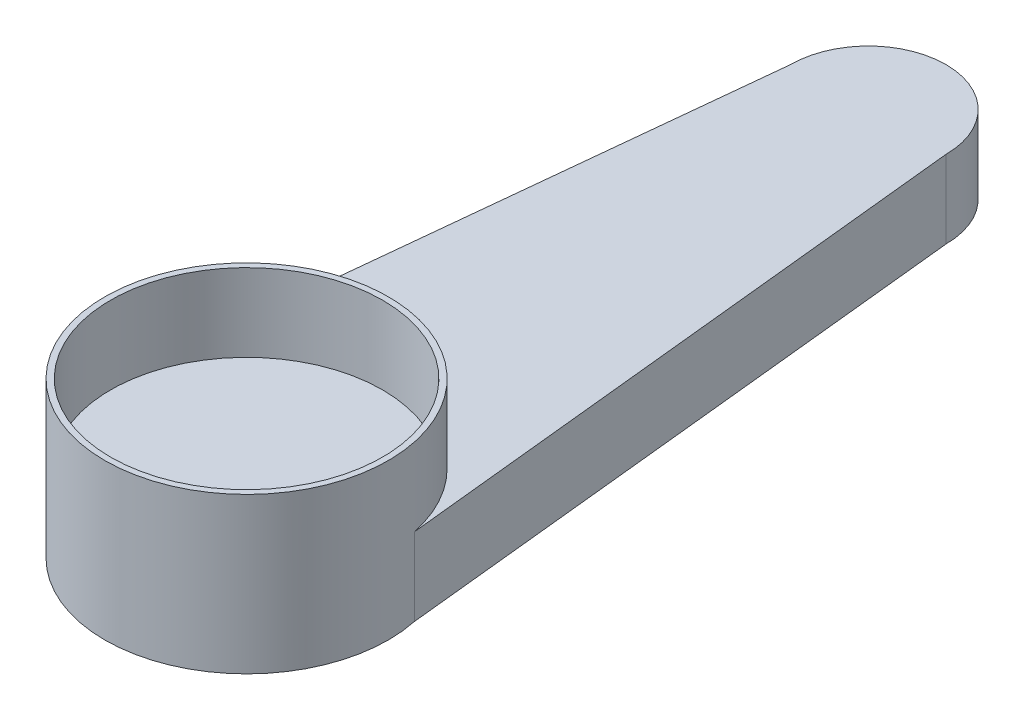
ISO-10303-21;
HEADER;
FILE_DESCRIPTION(('STEP AP214'),'2;1');
FILE_NAME('part.step','',(''),(''),'','','');
FILE_SCHEMA(('AUTOMOTIVE_DESIGN { 1 0 10303 214 1 1 1 1 }'));
ENDSEC;
DATA;
#1=APPLICATION_CONTEXT('core data for automotive mechanical design processes');
#2=APPLICATION_PROTOCOL_DEFINITION('international standard','automotive_design',2000,#1);
#3=PRODUCT_CONTEXT('',#1,'mechanical');
#4=PRODUCT('Part','Part','',(#3));
#5=PRODUCT_RELATED_PRODUCT_CATEGORY('part','',(#4));
#6=PRODUCT_DEFINITION_FORMATION('','',#4);
#7=PRODUCT_DEFINITION_CONTEXT('part definition',#1,'design');
#8=PRODUCT_DEFINITION('design','',#6,#7);
#9=PRODUCT_DEFINITION_SHAPE('','',#8);
#10=(LENGTH_UNIT() NAMED_UNIT(*) SI_UNIT(.MILLI.,.METRE.));
#11=(NAMED_UNIT(*) PLANE_ANGLE_UNIT() SI_UNIT($,.RADIAN.));
#12=(NAMED_UNIT(*) SI_UNIT($,.STERADIAN.) SOLID_ANGLE_UNIT());
#13=UNCERTAINTY_MEASURE_WITH_UNIT(LENGTH_MEASURE(1.E-05),#10,'distance_accuracy_value','');
#14=(GEOMETRIC_REPRESENTATION_CONTEXT(3) GLOBAL_UNCERTAINTY_ASSIGNED_CONTEXT((#13)) GLOBAL_UNIT_ASSIGNED_CONTEXT((#10,
#11,#12)) REPRESENTATION_CONTEXT('',''));
#15=CARTESIAN_POINT('',(0.,0.,0.));
#16=DIRECTION('',(0.,0.,1.));
#17=DIRECTION('',(1.,0.,0.));
#18=AXIS2_PLACEMENT_3D('',#15,#16,#17);
#19=CARTESIAN_POINT('',(0.,-2.,8.));
#20=DIRECTION('',(0.,1.,0.));
#21=DIRECTION('',(0.,0.,1.));
#22=AXIS2_PLACEMENT_3D('',#19,#20,#21);
#23=CYLINDRICAL_SURFACE('',#22,3.65);
#24=DIRECTION('',(0.,1.,0.));
#25=VECTOR('',#24,1.);
#26=CARTESIAN_POINT('',(3.57318314023713,-2.,7.25510923866304));
#27=LINE('',#26,#25);
#28=CARTESIAN_POINT('',(3.57318314023713,-2.,7.25510923866304));
#29=VERTEX_POINT('',#28);
#30=CARTESIAN_POINT('',(3.57318314023713,0.,7.25510923866304));
#31=VERTEX_POINT('',#30);
#32=EDGE_CURVE('E36',#29,#31,#27,.T.);
#33=ORIENTED_EDGE('',*,*,#32,.T.);
#34=CARTESIAN_POINT('',(0.,0.,8.));
#35=DIRECTION('',(0.,1.,0.));
#36=DIRECTION('',(0.,0.,1.));
#37=AXIS2_PLACEMENT_3D('',#34,#35,#36);
#38=CIRCLE('',#37,3.65);
#39=CARTESIAN_POINT('',(-3.57318314023713,0.,7.25510923866304));
#40=VERTEX_POINT('',#39);
#41=EDGE_CURVE('E89',#31,#40,#38,.T.);
#42=ORIENTED_EDGE('',*,*,#41,.T.);
#43=DIRECTION('',(0.,1.,0.));
#44=VECTOR('',#43,1.);
#45=CARTESIAN_POINT('',(-3.57318314023713,-2.,7.25510923866304));
#46=LINE('',#45,#44);
#47=CARTESIAN_POINT('',(-3.57318314023713,-2.,7.25510923866304));
#48=VERTEX_POINT('',#47);
#49=EDGE_CURVE('E11',#48,#40,#46,.T.);
#50=ORIENTED_EDGE('',*,*,#49,.F.);
#51=CARTESIAN_POINT('',(0.,-2.,8.));
#52=DIRECTION('',(0.,1.,0.));
#53=DIRECTION('',(0.,0.,1.));
#54=AXIS2_PLACEMENT_3D('',#51,#52,#53);
#55=CIRCLE('',#54,3.65);
#56=EDGE_CURVE('E91',#48,#29,#55,.T.);
#57=ORIENTED_EDGE('',*,*,#56,.T.);
#58=EDGE_LOOP('',(#33,#42,#50,#57));
#59=FACE_BOUND('',#58,.T.);
#60=CARTESIAN_POINT('',(0.,2.,8.));
#61=DIRECTION('',(0.,1.,0.));
#62=DIRECTION('',(0.,0.,1.));
#63=AXIS2_PLACEMENT_3D('',#60,#61,#62);
#64=CIRCLE('',#63,3.65);
#65=CARTESIAN_POINT('',(0.,2.,11.65));
#66=VERTEX_POINT('',#65);
#67=EDGE_CURVE('E86',#66,#66,#64,.T.);
#68=ORIENTED_EDGE('',*,*,#67,.F.);
#69=EDGE_LOOP('',(#68));
#70=FACE_BOUND('',#69,.T.);
#71=ADVANCED_FACE('F33',(#59,#70),#23,.T.);
#72=CARTESIAN_POINT('',(-3.57318314023713,-2.,7.25510923866304));
#73=DIRECTION('',(0.994724656625258,0.,0.10258098021448));
#74=DIRECTION('',(0.10258098021448,0.,-0.994724656625258));
#75=AXIS2_PLACEMENT_3D('',#72,#73,#74);
#76=PLANE('',#75);
#77=DIRECTION('',(0.10258098021448,0.,-0.994724656625257));
#78=VECTOR('',#77,1.);
#79=CARTESIAN_POINT('',(-3.57318314023713,0.,7.25510923866304));
#80=LINE('',#79,#78);
#81=CARTESIAN_POINT('',(-2.00000000000001,0.,-8.));
#82=VERTEX_POINT('',#81);
#83=EDGE_CURVE('E94',#40,#82,#80,.T.);
#84=ORIENTED_EDGE('',*,*,#83,.T.);
#85=DIRECTION('',(0.,1.,0.));
#86=VECTOR('',#85,1.);
#87=CARTESIAN_POINT('',(-2.00000000000001,-2.,-8.));
#88=LINE('',#87,#86);
#89=CARTESIAN_POINT('',(-2.00000000000001,-2.,-8.));
#90=VERTEX_POINT('',#89);
#91=EDGE_CURVE('E42',#90,#82,#88,.T.);
#92=ORIENTED_EDGE('',*,*,#91,.F.);
#93=DIRECTION('',(0.10258098021448,0.,-0.994724656625257));
#94=VECTOR('',#93,1.);
#95=CARTESIAN_POINT('',(-3.57318314023713,-2.,7.25510923866304));
#96=LINE('',#95,#94);
#97=EDGE_CURVE('E92',#48,#90,#96,.T.);
#98=ORIENTED_EDGE('',*,*,#97,.F.);
#99=ORIENTED_EDGE('',*,*,#49,.T.);
#100=EDGE_LOOP('',(#84,#92,#98,#99));
#101=FACE_BOUND('',#100,.T.);
#102=ADVANCED_FACE('F112',(#101),#76,.F.);
#103=CARTESIAN_POINT('',(0.,-2.,-8.));
#104=DIRECTION('',(0.,1.,0.));
#105=DIRECTION('',(0.,0.,1.));
#106=AXIS2_PLACEMENT_3D('',#103,#104,#105);
#107=CYLINDRICAL_SURFACE('',#106,2.);
#108=CARTESIAN_POINT('',(0.,0.,-8.));
#109=DIRECTION('',(0.,1.,0.));
#110=DIRECTION('',(0.,0.,1.));
#111=AXIS2_PLACEMENT_3D('',#108,#109,#110);
#112=CIRCLE('',#111,2.);
#113=CARTESIAN_POINT('',(2.,0.,-8.));
#114=VERTEX_POINT('',#113);
#115=EDGE_CURVE('E85',#114,#82,#112,.T.);
#116=ORIENTED_EDGE('',*,*,#115,.F.);
#117=DIRECTION('',(0.,1.,0.));
#118=VECTOR('',#117,1.);
#119=CARTESIAN_POINT('',(2.,-2.,-8.));
#120=LINE('',#119,#118);
#121=CARTESIAN_POINT('',(2.,-2.,-8.));
#122=VERTEX_POINT('',#121);
#123=EDGE_CURVE('E81',#122,#114,#120,.T.);
#124=ORIENTED_EDGE('',*,*,#123,.F.);
#125=CARTESIAN_POINT('',(0.,-2.,-8.));
#126=DIRECTION('',(0.,1.,0.));
#127=DIRECTION('',(0.,0.,1.));
#128=AXIS2_PLACEMENT_3D('',#125,#126,#127);
#129=CIRCLE('',#128,2.);
#130=EDGE_CURVE('E107',#122,#90,#129,.T.);
#131=ORIENTED_EDGE('',*,*,#130,.T.);
#132=ORIENTED_EDGE('',*,*,#91,.T.);
#133=EDGE_LOOP('',(#116,#124,#131,#132));
#134=FACE_BOUND('',#133,.T.);
#135=ADVANCED_FACE('F113',(#134),#107,.T.);
#136=CARTESIAN_POINT('',(3.57318314023713,-2.,7.25510923866304));
#137=DIRECTION('',(0.994724656625258,0.,-0.10258098021448));
#138=DIRECTION('',(-0.10258098021448,0.,-0.994724656625258));
#139=AXIS2_PLACEMENT_3D('',#136,#137,#138);
#140=PLANE('',#139);
#141=DIRECTION('',(-0.10258098021448,0.,-0.994724656625257));
#142=VECTOR('',#141,1.);
#143=CARTESIAN_POINT('',(3.57318314023713,0.,7.25510923866304));
#144=LINE('',#143,#142);
#145=EDGE_CURVE('E79',#31,#114,#144,.T.);
#146=ORIENTED_EDGE('',*,*,#145,.F.);
#147=ORIENTED_EDGE('',*,*,#32,.F.);
#148=DIRECTION('',(-0.10258098021448,0.,-0.994724656625257));
#149=VECTOR('',#148,1.);
#150=CARTESIAN_POINT('',(3.57318314023713,-2.,7.25510923866304));
#151=LINE('',#150,#149);
#152=EDGE_CURVE('E105',#29,#122,#151,.T.);
#153=ORIENTED_EDGE('',*,*,#152,.T.);
#154=ORIENTED_EDGE('',*,*,#123,.T.);
#155=EDGE_LOOP('',(#146,#147,#153,#154));
#156=FACE_BOUND('',#155,.T.);
#157=ADVANCED_FACE('F80',(#156),#140,.T.);
#158=CARTESIAN_POINT('',(0.,-2.,8.));
#159=DIRECTION('',(0.,1.,0.));
#160=DIRECTION('',(0.,0.,1.));
#161=AXIS2_PLACEMENT_3D('',#158,#159,#160);
#162=PLANE('',#161);
#163=ORIENTED_EDGE('',*,*,#56,.F.);
#164=ORIENTED_EDGE('',*,*,#97,.T.);
#165=ORIENTED_EDGE('',*,*,#130,.F.);
#166=ORIENTED_EDGE('',*,*,#152,.F.);
#167=EDGE_LOOP('',(#163,#164,#165,#166));
#168=FACE_BOUND('',#167,.T.);
#169=ADVANCED_FACE('F116',(#168),#162,.F.);
#170=CARTESIAN_POINT('',(0.,0.,8.));
#171=DIRECTION('',(0.,1.,0.));
#172=DIRECTION('',(0.,0.,1.));
#173=AXIS2_PLACEMENT_3D('',#170,#171,#172);
#174=PLANE('',#173);
#175=ORIENTED_EDGE('',*,*,#41,.F.);
#176=ORIENTED_EDGE('',*,*,#145,.T.);
#177=ORIENTED_EDGE('',*,*,#115,.T.);
#178=ORIENTED_EDGE('',*,*,#83,.F.);
#179=EDGE_LOOP('',(#175,#176,#177,#178));
#180=FACE_BOUND('',#179,.T.);
#181=ADVANCED_FACE('F93',(#180),#174,.T.);
#182=CARTESIAN_POINT('',(0.,2.,8.));
#183=DIRECTION('',(0.,1.,0.));
#184=DIRECTION('',(0.,0.,1.));
#185=AXIS2_PLACEMENT_3D('',#182,#183,#184);
#186=PLANE('',#185);
#187=CARTESIAN_POINT('',(0.,2.,8.));
#188=DIRECTION('',(0.,1.,0.));
#189=DIRECTION('',(0.,0.,1.));
#190=AXIS2_PLACEMENT_3D('',#187,#188,#189);
#191=CIRCLE('',#190,3.5);
#192=CARTESIAN_POINT('',(0.,2.,11.5));
#193=VERTEX_POINT('',#192);
#194=EDGE_CURVE('E100',#193,#193,#191,.T.);
#195=ORIENTED_EDGE('',*,*,#194,.F.);
#196=EDGE_LOOP('',(#195));
#197=FACE_BOUND('',#196,.T.);
#198=ORIENTED_EDGE('',*,*,#67,.T.);
#199=EDGE_LOOP('',(#198));
#200=FACE_BOUND('',#199,.T.);
#201=ADVANCED_FACE('F123',(#197,#200),#186,.T.);
#202=CARTESIAN_POINT('',(0.,0.,8.));
#203=DIRECTION('',(0.,1.,0.));
#204=DIRECTION('',(0.,0.,1.));
#205=AXIS2_PLACEMENT_3D('',#202,#203,#204);
#206=CYLINDRICAL_SURFACE('',#205,3.5);
#207=CARTESIAN_POINT('',(0.,0.,8.));
#208=DIRECTION('',(0.,1.,0.));
#209=DIRECTION('',(0.,0.,1.));
#210=AXIS2_PLACEMENT_3D('',#207,#208,#209);
#211=CIRCLE('',#210,3.5);
#212=CARTESIAN_POINT('',(0.,0.,11.5));
#213=VERTEX_POINT('',#212);
#214=EDGE_CURVE('E95',#213,#213,#211,.T.);
#215=ORIENTED_EDGE('',*,*,#214,.F.);
#216=EDGE_LOOP('',(#215));
#217=FACE_BOUND('',#216,.T.);
#218=ORIENTED_EDGE('',*,*,#194,.T.);
#219=EDGE_LOOP('',(#218));
#220=FACE_BOUND('',#219,.T.);
#221=ADVANCED_FACE('F169',(#217,#220),#206,.F.);
#222=CARTESIAN_POINT('',(0.,0.,8.));
#223=DIRECTION('',(0.,1.,0.));
#224=DIRECTION('',(0.,0.,1.));
#225=AXIS2_PLACEMENT_3D('',#222,#223,#224);
#226=PLANE('',#225);
#227=ORIENTED_EDGE('',*,*,#214,.T.);
#228=EDGE_LOOP('',(#227));
#229=FACE_BOUND('',#228,.T.);
#230=ADVANCED_FACE('F178',(#229),#226,.T.);
#231=CLOSED_SHELL('',(#71,#102,#135,#157,#169,#181,#201,#221,#230));
#232=MANIFOLD_SOLID_BREP('B2',#231);
#233=ADVANCED_BREP_SHAPE_REPRESENTATION('',(#18,#232),#14);
#234=SHAPE_DEFINITION_REPRESENTATION(#9,#233);
ENDSEC;
END-ISO-10303-21;
